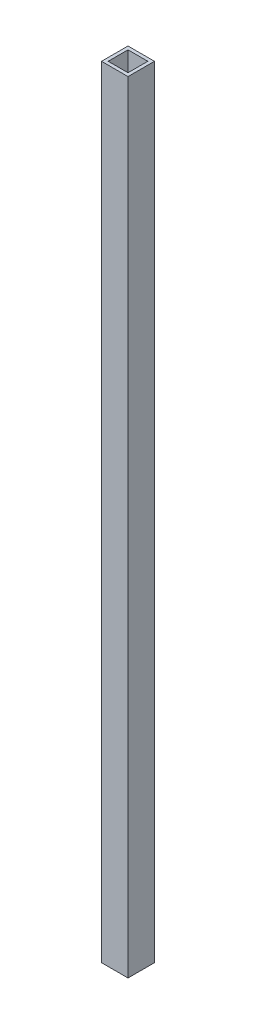
ISO-10303-21;
HEADER;
FILE_DESCRIPTION(('STEP AP214'),'2;1');
FILE_NAME('part.step','',(''),(''),'','','');
FILE_SCHEMA(('AUTOMOTIVE_DESIGN { 1 0 10303 214 1 1 1 1 }'));
ENDSEC;
DATA;
#1=APPLICATION_CONTEXT('core data for automotive mechanical design processes');
#2=APPLICATION_PROTOCOL_DEFINITION('international standard','automotive_design',2000,#1);
#3=PRODUCT_CONTEXT('',#1,'mechanical');
#4=PRODUCT('Part','Part','',(#3));
#5=PRODUCT_RELATED_PRODUCT_CATEGORY('part','',(#4));
#6=PRODUCT_DEFINITION_FORMATION('','',#4);
#7=PRODUCT_DEFINITION_CONTEXT('part definition',#1,'design');
#8=PRODUCT_DEFINITION('design','',#6,#7);
#9=PRODUCT_DEFINITION_SHAPE('','',#8);
#10=(LENGTH_UNIT() NAMED_UNIT(*) SI_UNIT(.MILLI.,.METRE.));
#11=(NAMED_UNIT(*) PLANE_ANGLE_UNIT() SI_UNIT($,.RADIAN.));
#12=(NAMED_UNIT(*) SI_UNIT($,.STERADIAN.) SOLID_ANGLE_UNIT());
#13=UNCERTAINTY_MEASURE_WITH_UNIT(LENGTH_MEASURE(1.E-05),#10,'distance_accuracy_value','');
#14=(GEOMETRIC_REPRESENTATION_CONTEXT(3) GLOBAL_UNCERTAINTY_ASSIGNED_CONTEXT((#13)) GLOBAL_UNIT_ASSIGNED_CONTEXT((#10,
#11,#12)) REPRESENTATION_CONTEXT('',''));
#15=CARTESIAN_POINT('',(0.,0.,0.));
#16=DIRECTION('',(0.,0.,1.));
#17=DIRECTION('',(1.,0.,0.));
#18=AXIS2_PLACEMENT_3D('',#15,#16,#17);
#19=CARTESIAN_POINT('',(0.,749.3,0.));
#20=DIRECTION('',(0.,-1.,0.));
#21=DIRECTION('',(0.,0.,-1.));
#22=AXIS2_PLACEMENT_3D('',#19,#20,#21);
#23=PLANE('',#22);
#24=DIRECTION('',(0.,0.,-1.));
#25=VECTOR('',#24,1.);
#26=CARTESIAN_POINT('',(12.7,749.3,12.7));
#27=LINE('',#26,#25);
#28=CARTESIAN_POINT('',(12.7,749.3,12.7));
#29=VERTEX_POINT('',#28);
#30=CARTESIAN_POINT('',(12.7,749.3,-12.7));
#31=VERTEX_POINT('',#30);
#32=EDGE_CURVE('E138',#29,#31,#27,.T.);
#33=ORIENTED_EDGE('',*,*,#32,.T.);
#34=DIRECTION('',(-1.,0.,0.));
#35=VECTOR('',#34,1.);
#36=CARTESIAN_POINT('',(-12.7,749.3,-12.7));
#37=LINE('',#36,#35);
#38=CARTESIAN_POINT('',(-12.7,749.3,-12.7));
#39=VERTEX_POINT('',#38);
#40=EDGE_CURVE('E141',#31,#39,#37,.T.);
#41=ORIENTED_EDGE('',*,*,#40,.T.);
#42=DIRECTION('',(0.,0.,1.));
#43=VECTOR('',#42,1.);
#44=CARTESIAN_POINT('',(-12.7,749.3,12.7));
#45=LINE('',#44,#43);
#46=CARTESIAN_POINT('',(-12.7,749.3,12.7));
#47=VERTEX_POINT('',#46);
#48=EDGE_CURVE('E144',#39,#47,#45,.T.);
#49=ORIENTED_EDGE('',*,*,#48,.T.);
#50=DIRECTION('',(1.,0.,0.));
#51=VECTOR('',#50,1.);
#52=CARTESIAN_POINT('',(-12.7,749.3,12.7));
#53=LINE('',#52,#51);
#54=EDGE_CURVE('E146',#47,#29,#53,.T.);
#55=ORIENTED_EDGE('',*,*,#54,.T.);
#56=EDGE_LOOP('',(#33,#41,#49,#55));
#57=FACE_BOUND('',#56,.T.);
#58=DIRECTION('',(0.,0.,-1.));
#59=VECTOR('',#58,1.);
#60=CARTESIAN_POINT('',(9.525,749.3,-9.525));
#61=LINE('',#60,#59);
#62=CARTESIAN_POINT('',(9.52500000000001,749.3,9.525));
#63=VERTEX_POINT('',#62);
#64=CARTESIAN_POINT('',(9.525,749.3,-9.525));
#65=VERTEX_POINT('',#64);
#66=EDGE_CURVE('E102',#63,#65,#61,.T.);
#67=ORIENTED_EDGE('',*,*,#66,.F.);
#68=DIRECTION('',(1.,0.,0.));
#69=VECTOR('',#68,1.);
#70=CARTESIAN_POINT('',(-9.525,749.3,9.525));
#71=LINE('',#70,#69);
#72=CARTESIAN_POINT('',(-9.525,749.3,9.525));
#73=VERTEX_POINT('',#72);
#74=EDGE_CURVE('E124',#73,#63,#71,.T.);
#75=ORIENTED_EDGE('',*,*,#74,.F.);
#76=DIRECTION('',(0.,0.,1.));
#77=VECTOR('',#76,1.);
#78=CARTESIAN_POINT('',(-9.525,749.3,-9.525));
#79=LINE('',#78,#77);
#80=CARTESIAN_POINT('',(-9.525,749.3,-9.525));
#81=VERTEX_POINT('',#80);
#82=EDGE_CURVE('E122',#81,#73,#79,.T.);
#83=ORIENTED_EDGE('',*,*,#82,.F.);
#84=DIRECTION('',(-1.,0.,0.));
#85=VECTOR('',#84,1.);
#86=CARTESIAN_POINT('',(-9.525,749.3,-9.525));
#87=LINE('',#86,#85);
#88=EDGE_CURVE('E110',#65,#81,#87,.T.);
#89=ORIENTED_EDGE('',*,*,#88,.F.);
#90=EDGE_LOOP('',(#67,#75,#83,#89));
#91=FACE_BOUND('',#90,.T.);
#92=ADVANCED_FACE('F37',(#57,#91),#23,.F.);
#93=CARTESIAN_POINT('',(0.,0.,0.));
#94=DIRECTION('',(0.,-1.,0.));
#95=DIRECTION('',(0.,0.,-1.));
#96=AXIS2_PLACEMENT_3D('',#93,#94,#95);
#97=PLANE('',#96);
#98=DIRECTION('',(0.,0.,-1.));
#99=VECTOR('',#98,1.);
#100=CARTESIAN_POINT('',(12.7,0.,12.7));
#101=LINE('',#100,#99);
#102=CARTESIAN_POINT('',(12.7,0.,12.7));
#103=VERTEX_POINT('',#102);
#104=CARTESIAN_POINT('',(12.7,0.,-12.7));
#105=VERTEX_POINT('',#104);
#106=EDGE_CURVE('E118',#103,#105,#101,.T.);
#107=ORIENTED_EDGE('',*,*,#106,.F.);
#108=DIRECTION('',(1.,0.,0.));
#109=VECTOR('',#108,1.);
#110=CARTESIAN_POINT('',(-12.7,0.,12.7));
#111=LINE('',#110,#109);
#112=CARTESIAN_POINT('',(-12.7,0.,12.7));
#113=VERTEX_POINT('',#112);
#114=EDGE_CURVE('E142',#113,#103,#111,.T.);
#115=ORIENTED_EDGE('',*,*,#114,.F.);
#116=DIRECTION('',(0.,0.,1.));
#117=VECTOR('',#116,1.);
#118=CARTESIAN_POINT('',(-12.7,0.,12.7));
#119=LINE('',#118,#117);
#120=CARTESIAN_POINT('',(-12.7,0.,-12.7));
#121=VERTEX_POINT('',#120);
#122=EDGE_CURVE('E153',#121,#113,#119,.T.);
#123=ORIENTED_EDGE('',*,*,#122,.F.);
#124=DIRECTION('',(-1.,0.,0.));
#125=VECTOR('',#124,1.);
#126=CARTESIAN_POINT('',(-12.7,0.,-12.7));
#127=LINE('',#126,#125);
#128=EDGE_CURVE('E151',#105,#121,#127,.T.);
#129=ORIENTED_EDGE('',*,*,#128,.F.);
#130=EDGE_LOOP('',(#107,#115,#123,#129));
#131=FACE_BOUND('',#130,.T.);
#132=DIRECTION('',(1.,0.,0.));
#133=VECTOR('',#132,1.);
#134=CARTESIAN_POINT('',(-9.525,0.,9.525));
#135=LINE('',#134,#133);
#136=CARTESIAN_POINT('',(-9.525,0.,9.525));
#137=VERTEX_POINT('',#136);
#138=CARTESIAN_POINT('',(9.52500000000001,0.,9.525));
#139=VERTEX_POINT('',#138);
#140=EDGE_CURVE('E111',#137,#139,#135,.T.);
#141=ORIENTED_EDGE('',*,*,#140,.T.);
#142=DIRECTION('',(0.,0.,-1.));
#143=VECTOR('',#142,1.);
#144=CARTESIAN_POINT('',(9.525,0.,-9.525));
#145=LINE('',#144,#143);
#146=CARTESIAN_POINT('',(9.525,0.,-9.525));
#147=VERTEX_POINT('',#146);
#148=EDGE_CURVE('E60',#139,#147,#145,.T.);
#149=ORIENTED_EDGE('',*,*,#148,.T.);
#150=DIRECTION('',(-1.,0.,0.));
#151=VECTOR('',#150,1.);
#152=CARTESIAN_POINT('',(-9.525,0.,-9.525));
#153=LINE('',#152,#151);
#154=CARTESIAN_POINT('',(-9.525,0.,-9.525));
#155=VERTEX_POINT('',#154);
#156=EDGE_CURVE('E117',#147,#155,#153,.T.);
#157=ORIENTED_EDGE('',*,*,#156,.T.);
#158=DIRECTION('',(0.,0.,1.));
#159=VECTOR('',#158,1.);
#160=CARTESIAN_POINT('',(-9.525,0.,-9.525));
#161=LINE('',#160,#159);
#162=EDGE_CURVE('E130',#155,#137,#161,.T.);
#163=ORIENTED_EDGE('',*,*,#162,.T.);
#164=EDGE_LOOP('',(#141,#149,#157,#163));
#165=FACE_BOUND('',#164,.T.);
#166=ADVANCED_FACE('F171',(#131,#165),#97,.T.);
#167=CARTESIAN_POINT('',(12.7,749.3,12.7));
#168=DIRECTION('',(-1.,0.,0.));
#169=DIRECTION('',(0.,0.,1.));
#170=AXIS2_PLACEMENT_3D('',#167,#168,#169);
#171=PLANE('',#170);
#172=ORIENTED_EDGE('',*,*,#106,.T.);
#173=DIRECTION('',(0.,-1.,0.));
#174=VECTOR('',#173,1.);
#175=CARTESIAN_POINT('',(12.7,749.3,-12.7));
#176=LINE('',#175,#174);
#177=EDGE_CURVE('E11',#31,#105,#176,.T.);
#178=ORIENTED_EDGE('',*,*,#177,.F.);
#179=ORIENTED_EDGE('',*,*,#32,.F.);
#180=DIRECTION('',(0.,-1.,0.));
#181=VECTOR('',#180,1.);
#182=CARTESIAN_POINT('',(12.7,749.3,12.7));
#183=LINE('',#182,#181);
#184=EDGE_CURVE('E148',#29,#103,#183,.T.);
#185=ORIENTED_EDGE('',*,*,#184,.T.);
#186=EDGE_LOOP('',(#172,#178,#179,#185));
#187=FACE_BOUND('',#186,.T.);
#188=ADVANCED_FACE('F39',(#187),#171,.F.);
#189=CARTESIAN_POINT('',(-12.7,749.3,-12.7));
#190=DIRECTION('',(0.,0.,1.));
#191=DIRECTION('',(1.,0.,0.));
#192=AXIS2_PLACEMENT_3D('',#189,#190,#191);
#193=PLANE('',#192);
#194=ORIENTED_EDGE('',*,*,#128,.T.);
#195=DIRECTION('',(0.,-1.,0.));
#196=VECTOR('',#195,1.);
#197=CARTESIAN_POINT('',(-12.7,749.3,-12.7));
#198=LINE('',#197,#196);
#199=EDGE_CURVE('E45',#39,#121,#198,.T.);
#200=ORIENTED_EDGE('',*,*,#199,.F.);
#201=ORIENTED_EDGE('',*,*,#40,.F.);
#202=ORIENTED_EDGE('',*,*,#177,.T.);
#203=EDGE_LOOP('',(#194,#200,#201,#202));
#204=FACE_BOUND('',#203,.T.);
#205=ADVANCED_FACE('F181',(#204),#193,.F.);
#206=CARTESIAN_POINT('',(-12.7,749.3,12.7));
#207=DIRECTION('',(1.,0.,0.));
#208=DIRECTION('',(0.,0.,-1.));
#209=AXIS2_PLACEMENT_3D('',#206,#207,#208);
#210=PLANE('',#209);
#211=ORIENTED_EDGE('',*,*,#122,.T.);
#212=DIRECTION('',(0.,-1.,0.));
#213=VECTOR('',#212,1.);
#214=CARTESIAN_POINT('',(-12.7,749.3,12.7));
#215=LINE('',#214,#213);
#216=EDGE_CURVE('E158',#47,#113,#215,.T.);
#217=ORIENTED_EDGE('',*,*,#216,.F.);
#218=ORIENTED_EDGE('',*,*,#48,.F.);
#219=ORIENTED_EDGE('',*,*,#199,.T.);
#220=EDGE_LOOP('',(#211,#217,#218,#219));
#221=FACE_BOUND('',#220,.T.);
#222=ADVANCED_FACE('F165',(#221),#210,.F.);
#223=CARTESIAN_POINT('',(-12.7,749.3,12.7));
#224=DIRECTION('',(0.,0.,-1.));
#225=DIRECTION('',(-1.,0.,0.));
#226=AXIS2_PLACEMENT_3D('',#223,#224,#225);
#227=PLANE('',#226);
#228=ORIENTED_EDGE('',*,*,#114,.T.);
#229=ORIENTED_EDGE('',*,*,#184,.F.);
#230=ORIENTED_EDGE('',*,*,#54,.F.);
#231=ORIENTED_EDGE('',*,*,#216,.T.);
#232=EDGE_LOOP('',(#228,#229,#230,#231));
#233=FACE_BOUND('',#232,.T.);
#234=ADVANCED_FACE('F175',(#233),#227,.F.);
#235=CARTESIAN_POINT('',(9.525,749.3,-9.525));
#236=DIRECTION('',(-1.,0.,0.));
#237=DIRECTION('',(0.,0.,1.));
#238=AXIS2_PLACEMENT_3D('',#235,#236,#237);
#239=PLANE('',#238);
#240=ORIENTED_EDGE('',*,*,#148,.F.);
#241=DIRECTION('',(0.,-1.,0.));
#242=VECTOR('',#241,1.);
#243=CARTESIAN_POINT('',(9.52500000000001,749.3,9.525));
#244=LINE('',#243,#242);
#245=EDGE_CURVE('E106',#63,#139,#244,.T.);
#246=ORIENTED_EDGE('',*,*,#245,.F.);
#247=ORIENTED_EDGE('',*,*,#66,.T.);
#248=DIRECTION('',(0.,-1.,0.));
#249=VECTOR('',#248,1.);
#250=CARTESIAN_POINT('',(9.525,749.3,-9.525));
#251=LINE('',#250,#249);
#252=EDGE_CURVE('E105',#65,#147,#251,.T.);
#253=ORIENTED_EDGE('',*,*,#252,.T.);
#254=EDGE_LOOP('',(#240,#246,#247,#253));
#255=FACE_BOUND('',#254,.T.);
#256=ADVANCED_FACE('F104',(#255),#239,.T.);
#257=CARTESIAN_POINT('',(-9.525,749.3,-9.525));
#258=DIRECTION('',(0.,0.,1.));
#259=DIRECTION('',(1.,0.,0.));
#260=AXIS2_PLACEMENT_3D('',#257,#258,#259);
#261=PLANE('',#260);
#262=ORIENTED_EDGE('',*,*,#156,.F.);
#263=ORIENTED_EDGE('',*,*,#252,.F.);
#264=ORIENTED_EDGE('',*,*,#88,.T.);
#265=DIRECTION('',(0.,-1.,0.));
#266=VECTOR('',#265,1.);
#267=CARTESIAN_POINT('',(-9.525,749.3,-9.525));
#268=LINE('',#267,#266);
#269=EDGE_CURVE('E119',#81,#155,#268,.T.);
#270=ORIENTED_EDGE('',*,*,#269,.T.);
#271=EDGE_LOOP('',(#262,#263,#264,#270));
#272=FACE_BOUND('',#271,.T.);
#273=ADVANCED_FACE('F114',(#272),#261,.T.);
#274=CARTESIAN_POINT('',(-9.525,749.3,-9.525));
#275=DIRECTION('',(1.,0.,0.));
#276=DIRECTION('',(0.,0.,-1.));
#277=AXIS2_PLACEMENT_3D('',#274,#275,#276);
#278=PLANE('',#277);
#279=ORIENTED_EDGE('',*,*,#162,.F.);
#280=ORIENTED_EDGE('',*,*,#269,.F.);
#281=ORIENTED_EDGE('',*,*,#82,.T.);
#282=DIRECTION('',(0.,-1.,0.));
#283=VECTOR('',#282,1.);
#284=CARTESIAN_POINT('',(-9.525,749.3,9.525));
#285=LINE('',#284,#283);
#286=EDGE_CURVE('E52',#73,#137,#285,.T.);
#287=ORIENTED_EDGE('',*,*,#286,.T.);
#288=EDGE_LOOP('',(#279,#280,#281,#287));
#289=FACE_BOUND('',#288,.T.);
#290=ADVANCED_FACE('F204',(#289),#278,.T.);
#291=CARTESIAN_POINT('',(-9.525,749.3,9.525));
#292=DIRECTION('',(0.,0.,-1.));
#293=DIRECTION('',(-1.,0.,0.));
#294=AXIS2_PLACEMENT_3D('',#291,#292,#293);
#295=PLANE('',#294);
#296=ORIENTED_EDGE('',*,*,#140,.F.);
#297=ORIENTED_EDGE('',*,*,#286,.F.);
#298=ORIENTED_EDGE('',*,*,#74,.T.);
#299=ORIENTED_EDGE('',*,*,#245,.T.);
#300=EDGE_LOOP('',(#296,#297,#298,#299));
#301=FACE_BOUND('',#300,.T.);
#302=ADVANCED_FACE('F208',(#301),#295,.T.);
#303=CLOSED_SHELL('',(#92,#166,#188,#205,#222,#234,#256,#273,#290,#302));
#304=MANIFOLD_SOLID_BREP('B2',#303);
#305=ADVANCED_BREP_SHAPE_REPRESENTATION('',(#18,#304),#14);
#306=SHAPE_DEFINITION_REPRESENTATION(#9,#305);
ENDSEC;
END-ISO-10303-21;
